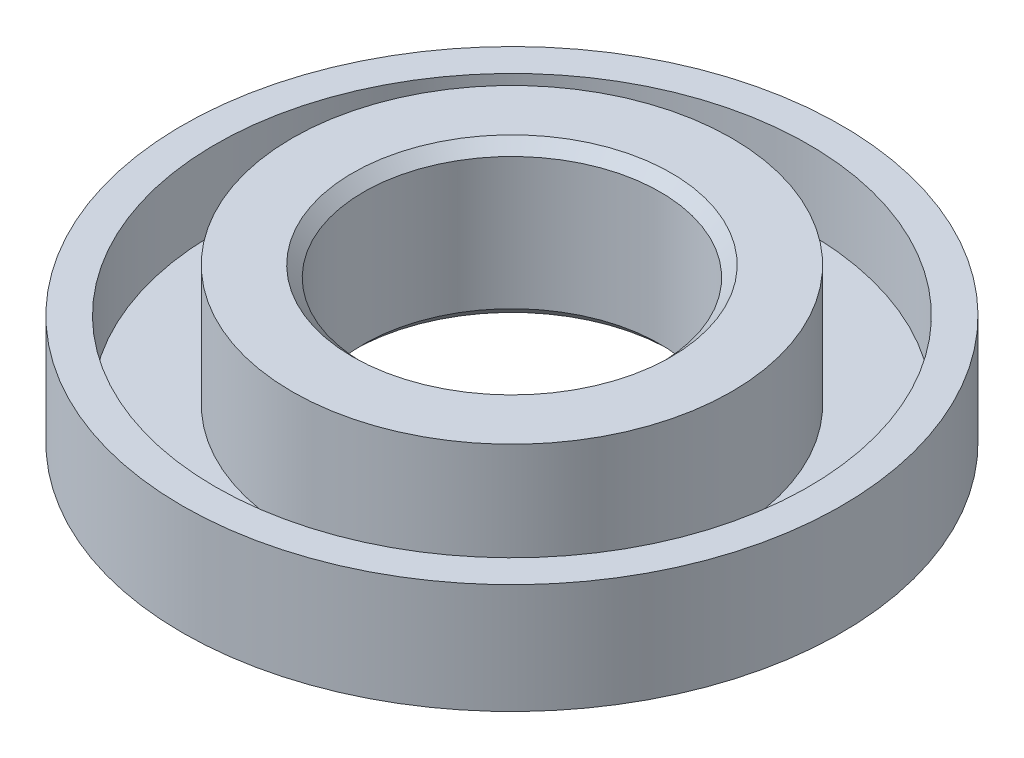
ISO-10303-21;
HEADER;
FILE_DESCRIPTION(('STEP AP214'),'2;1');
FILE_NAME('part.step','',(''),(''),'','','');
FILE_SCHEMA(('AUTOMOTIVE_DESIGN { 1 0 10303 214 1 1 1 1 }'));
ENDSEC;
DATA;
#1=APPLICATION_CONTEXT('core data for automotive mechanical design processes');
#2=APPLICATION_PROTOCOL_DEFINITION('international standard','automotive_design',2000,#1);
#3=PRODUCT_CONTEXT('',#1,'mechanical');
#4=PRODUCT('Part','Part','',(#3));
#5=PRODUCT_RELATED_PRODUCT_CATEGORY('part','',(#4));
#6=PRODUCT_DEFINITION_FORMATION('','',#4);
#7=PRODUCT_DEFINITION_CONTEXT('part definition',#1,'design');
#8=PRODUCT_DEFINITION('design','',#6,#7);
#9=PRODUCT_DEFINITION_SHAPE('','',#8);
#10=(LENGTH_UNIT() NAMED_UNIT(*) SI_UNIT(.MILLI.,.METRE.));
#11=(NAMED_UNIT(*) PLANE_ANGLE_UNIT() SI_UNIT($,.RADIAN.));
#12=(NAMED_UNIT(*) SI_UNIT($,.STERADIAN.) SOLID_ANGLE_UNIT());
#13=UNCERTAINTY_MEASURE_WITH_UNIT(LENGTH_MEASURE(1.E-05),#10,'distance_accuracy_value','');
#14=(GEOMETRIC_REPRESENTATION_CONTEXT(3) GLOBAL_UNCERTAINTY_ASSIGNED_CONTEXT((#13)) GLOBAL_UNIT_ASSIGNED_CONTEXT((#10,
#11,#12)) REPRESENTATION_CONTEXT('',''));
#15=CARTESIAN_POINT('',(0.,0.,0.));
#16=DIRECTION('',(0.,0.,1.));
#17=DIRECTION('',(1.,0.,0.));
#18=AXIS2_PLACEMENT_3D('',#15,#16,#17);
#19=CARTESIAN_POINT('',(14.4999999999999,14.0000000000001,0.));
#20=DIRECTION('',(0.,1.,0.));
#21=DIRECTION('',(0.,0.,1.));
#22=AXIS2_PLACEMENT_3D('',#19,#20,#21);
#23=PLANE('',#22);
#24=CARTESIAN_POINT('',(0.,14.0000000000001,0.));
#25=DIRECTION('',(0.,1.,0.));
#26=DIRECTION('',(0.,0.,1.));
#27=AXIS2_PLACEMENT_3D('',#24,#25,#26);
#28=CIRCLE('',#27,19.9999999999999);
#29=CARTESIAN_POINT('',(0.,14.0000000000001,19.9999999999999));
#30=VERTEX_POINT('',#29);
#31=EDGE_CURVE('E10',#30,#30,#28,.T.);
#32=ORIENTED_EDGE('',*,*,#31,.T.);
#33=EDGE_LOOP('',(#32));
#34=FACE_BOUND('',#33,.T.);
#35=CARTESIAN_POINT('',(0.,14.0000000000001,0.));
#36=DIRECTION('',(0.,1.,0.));
#37=DIRECTION('',(0.,0.,1.));
#38=AXIS2_PLACEMENT_3D('',#35,#36,#37);
#39=CIRCLE('',#38,14.4999999999999);
#40=CARTESIAN_POINT('',(0.,14.0000000000001,14.4999999999999));
#41=VERTEX_POINT('',#40);
#42=EDGE_CURVE('E65',#41,#41,#39,.T.);
#43=ORIENTED_EDGE('',*,*,#42,.F.);
#44=EDGE_LOOP('',(#43));
#45=FACE_BOUND('',#44,.T.);
#46=ADVANCED_FACE('F31',(#34,#45),#23,.T.);
#47=CARTESIAN_POINT('',(0.,1.13624387676481E-13,0.));
#48=DIRECTION('',(0.,1.,0.));
#49=DIRECTION('',(0.,0.,1.));
#50=AXIS2_PLACEMENT_3D('',#47,#48,#49);
#51=CYLINDRICAL_SURFACE('',#50,19.9999999999999);
#52=CARTESIAN_POINT('',(0.,3.00000000000011,0.));
#53=DIRECTION('',(0.,1.,0.));
#54=DIRECTION('',(0.,0.,1.));
#55=AXIS2_PLACEMENT_3D('',#52,#53,#54);
#56=CIRCLE('',#55,19.9999999999999);
#57=CARTESIAN_POINT('',(0.,3.00000000000011,19.9999999999999));
#58=VERTEX_POINT('',#57);
#59=EDGE_CURVE('E37',#58,#58,#56,.T.);
#60=ORIENTED_EDGE('',*,*,#59,.T.);
#61=EDGE_LOOP('',(#60));
#62=FACE_BOUND('',#61,.T.);
#63=ORIENTED_EDGE('',*,*,#31,.F.);
#64=EDGE_LOOP('',(#63));
#65=FACE_BOUND('',#64,.T.);
#66=ADVANCED_FACE('F73',(#62,#65),#51,.T.);
#67=CARTESIAN_POINT('',(19.9999999999999,3.00000000000011,0.));
#68=DIRECTION('',(0.,1.,0.));
#69=DIRECTION('',(0.,0.,1.));
#70=AXIS2_PLACEMENT_3D('',#67,#68,#69);
#71=PLANE('',#70);
#72=CARTESIAN_POINT('',(0.,3.00000000000011,0.));
#73=DIRECTION('',(0.,1.,0.));
#74=DIRECTION('',(0.,0.,1.));
#75=AXIS2_PLACEMENT_3D('',#72,#73,#74);
#76=CIRCLE('',#75,26.9999999999999);
#77=CARTESIAN_POINT('',(0.,3.00000000000011,26.9999999999999));
#78=VERTEX_POINT('',#77);
#79=EDGE_CURVE('E41',#78,#78,#76,.T.);
#80=ORIENTED_EDGE('',*,*,#79,.T.);
#81=EDGE_LOOP('',(#80));
#82=FACE_BOUND('',#81,.T.);
#83=ORIENTED_EDGE('',*,*,#59,.F.);
#84=EDGE_LOOP('',(#83));
#85=FACE_BOUND('',#84,.T.);
#86=ADVANCED_FACE('F77',(#82,#85),#71,.T.);
#87=CARTESIAN_POINT('',(0.,1.13624387676481E-13,0.));
#88=DIRECTION('',(0.,1.,0.));
#89=DIRECTION('',(0.,0.,1.));
#90=AXIS2_PLACEMENT_3D('',#87,#88,#89);
#91=CYLINDRICAL_SURFACE('',#90,26.9999999999999);
#92=CARTESIAN_POINT('',(0.,10.0000000000001,0.));
#93=DIRECTION('',(0.,1.,0.));
#94=DIRECTION('',(0.,0.,1.));
#95=AXIS2_PLACEMENT_3D('',#92,#93,#94);
#96=CIRCLE('',#95,26.9999999999999);
#97=CARTESIAN_POINT('',(0.,10.0000000000001,26.9999999999999));
#98=VERTEX_POINT('',#97);
#99=EDGE_CURVE('E45',#98,#98,#96,.T.);
#100=ORIENTED_EDGE('',*,*,#99,.T.);
#101=EDGE_LOOP('',(#100));
#102=FACE_BOUND('',#101,.T.);
#103=ORIENTED_EDGE('',*,*,#79,.F.);
#104=EDGE_LOOP('',(#103));
#105=FACE_BOUND('',#104,.T.);
#106=ADVANCED_FACE('F81',(#102,#105),#91,.F.);
#107=CARTESIAN_POINT('',(26.9999999999999,10.0000000000001,0.));
#108=DIRECTION('',(0.,1.,0.));
#109=DIRECTION('',(0.,0.,1.));
#110=AXIS2_PLACEMENT_3D('',#107,#108,#109);
#111=PLANE('',#110);
#112=CARTESIAN_POINT('',(0.,10.0000000000001,0.));
#113=DIRECTION('',(0.,1.,0.));
#114=DIRECTION('',(0.,0.,1.));
#115=AXIS2_PLACEMENT_3D('',#112,#113,#114);
#116=CIRCLE('',#115,29.9999999999999);
#117=CARTESIAN_POINT('',(0.,10.0000000000001,29.9999999999999));
#118=VERTEX_POINT('',#117);
#119=EDGE_CURVE('E50',#118,#118,#116,.T.);
#120=ORIENTED_EDGE('',*,*,#119,.T.);
#121=EDGE_LOOP('',(#120));
#122=FACE_BOUND('',#121,.T.);
#123=ORIENTED_EDGE('',*,*,#99,.F.);
#124=EDGE_LOOP('',(#123));
#125=FACE_BOUND('',#124,.T.);
#126=ADVANCED_FACE('F88',(#122,#125),#111,.T.);
#127=CARTESIAN_POINT('',(0.,1.13624387676481E-13,0.));
#128=DIRECTION('',(0.,1.,0.));
#129=DIRECTION('',(0.,0.,1.));
#130=AXIS2_PLACEMENT_3D('',#127,#128,#129);
#131=CYLINDRICAL_SURFACE('',#130,29.9999999999999);
#132=CARTESIAN_POINT('',(0.,1.13686837721616E-13,0.));
#133=DIRECTION('',(0.,1.,0.));
#134=DIRECTION('',(0.,0.,1.));
#135=AXIS2_PLACEMENT_3D('',#132,#133,#134);
#136=CIRCLE('',#135,29.9999999999999);
#137=CARTESIAN_POINT('',(0.,1.13686837721616E-13,29.9999999999999));
#138=VERTEX_POINT('',#137);
#139=EDGE_CURVE('E53',#138,#138,#136,.T.);
#140=ORIENTED_EDGE('',*,*,#139,.T.);
#141=EDGE_LOOP('',(#140));
#142=FACE_BOUND('',#141,.T.);
#143=ORIENTED_EDGE('',*,*,#119,.F.);
#144=EDGE_LOOP('',(#143));
#145=FACE_BOUND('',#144,.T.);
#146=ADVANCED_FACE('F92',(#142,#145),#131,.T.);
#147=CARTESIAN_POINT('',(29.9999999999999,1.13709822807673E-13,0.));
#148=DIRECTION('',(0.,-1.,0.));
#149=DIRECTION('',(0.,0.,-1.));
#150=AXIS2_PLACEMENT_3D('',#147,#148,#149);
#151=PLANE('',#150);
#152=CARTESIAN_POINT('',(0.,1.13732807893729E-13,0.));
#153=DIRECTION('',(0.,1.,0.));
#154=DIRECTION('',(0.,0.,1.));
#155=AXIS2_PLACEMENT_3D('',#152,#153,#154);
#156=CIRCLE('',#155,14.4999999999999);
#157=CARTESIAN_POINT('',(0.,1.13732807893729E-13,14.4999999999999));
#158=VERTEX_POINT('',#157);
#159=EDGE_CURVE('E56',#158,#158,#156,.T.);
#160=ORIENTED_EDGE('',*,*,#159,.T.);
#161=EDGE_LOOP('',(#160));
#162=FACE_BOUND('',#161,.T.);
#163=ORIENTED_EDGE('',*,*,#139,.F.);
#164=EDGE_LOOP('',(#163));
#165=FACE_BOUND('',#164,.T.);
#166=ADVANCED_FACE('F96',(#162,#165),#151,.T.);
#167=CARTESIAN_POINT('',(0.,1.13732807893729E-13,0.));
#168=DIRECTION('',(0.,-1.,0.));
#169=DIRECTION('',(0.,0.,-1.));
#170=AXIS2_PLACEMENT_3D('',#167,#168,#169);
#171=CONICAL_SURFACE('',#170,14.4999999999999,0.785398163397445);
#172=CARTESIAN_POINT('',(0.,1.00000000000012,0.));
#173=DIRECTION('',(0.,1.,0.));
#174=DIRECTION('',(0.,0.,1.));
#175=AXIS2_PLACEMENT_3D('',#172,#173,#174);
#176=CIRCLE('',#175,13.4999999999999);
#177=CARTESIAN_POINT('',(0.,1.00000000000012,13.4999999999999));
#178=VERTEX_POINT('',#177);
#179=EDGE_CURVE('E59',#178,#178,#176,.T.);
#180=ORIENTED_EDGE('',*,*,#179,.T.);
#181=EDGE_LOOP('',(#180));
#182=FACE_BOUND('',#181,.T.);
#183=ORIENTED_EDGE('',*,*,#159,.F.);
#184=EDGE_LOOP('',(#183));
#185=FACE_BOUND('',#184,.T.);
#186=ADVANCED_FACE('F100',(#182,#185),#171,.F.);
#187=CARTESIAN_POINT('',(0.,1.13624387676481E-13,0.));
#188=DIRECTION('',(0.,1.,0.));
#189=DIRECTION('',(0.,0.,1.));
#190=AXIS2_PLACEMENT_3D('',#187,#188,#189);
#191=CYLINDRICAL_SURFACE('',#190,13.4999999999999);
#192=CARTESIAN_POINT('',(0.,13.0000000000001,0.));
#193=DIRECTION('',(0.,1.,0.));
#194=DIRECTION('',(0.,0.,1.));
#195=AXIS2_PLACEMENT_3D('',#192,#193,#194);
#196=CIRCLE('',#195,13.4999999999999);
#197=CARTESIAN_POINT('',(0.,13.0000000000001,13.4999999999999));
#198=VERTEX_POINT('',#197);
#199=EDGE_CURVE('E62',#198,#198,#196,.T.);
#200=ORIENTED_EDGE('',*,*,#199,.T.);
#201=EDGE_LOOP('',(#200));
#202=FACE_BOUND('',#201,.T.);
#203=ORIENTED_EDGE('',*,*,#179,.F.);
#204=EDGE_LOOP('',(#203));
#205=FACE_BOUND('',#204,.T.);
#206=ADVANCED_FACE('F104',(#202,#205),#191,.F.);
#207=CARTESIAN_POINT('',(0.,13.0000000000001,0.));
#208=DIRECTION('',(0.,1.,0.));
#209=DIRECTION('',(0.,0.,1.));
#210=AXIS2_PLACEMENT_3D('',#207,#208,#209);
#211=CONICAL_SURFACE('',#210,13.4999999999999,0.785398163397449);
#212=ORIENTED_EDGE('',*,*,#42,.T.);
#213=EDGE_LOOP('',(#212));
#214=FACE_BOUND('',#213,.T.);
#215=ORIENTED_EDGE('',*,*,#199,.F.);
#216=EDGE_LOOP('',(#215));
#217=FACE_BOUND('',#216,.T.);
#218=ADVANCED_FACE('F69',(#214,#217),#211,.F.);
#219=CLOSED_SHELL('',(#46,#66,#86,#106,#126,#146,#166,#186,#206,#218));
#220=MANIFOLD_SOLID_BREP('B2',#219);
#221=ADVANCED_BREP_SHAPE_REPRESENTATION('',(#18,#220),#14);
#222=SHAPE_DEFINITION_REPRESENTATION(#9,#221);
ENDSEC;
END-ISO-10303-21;
